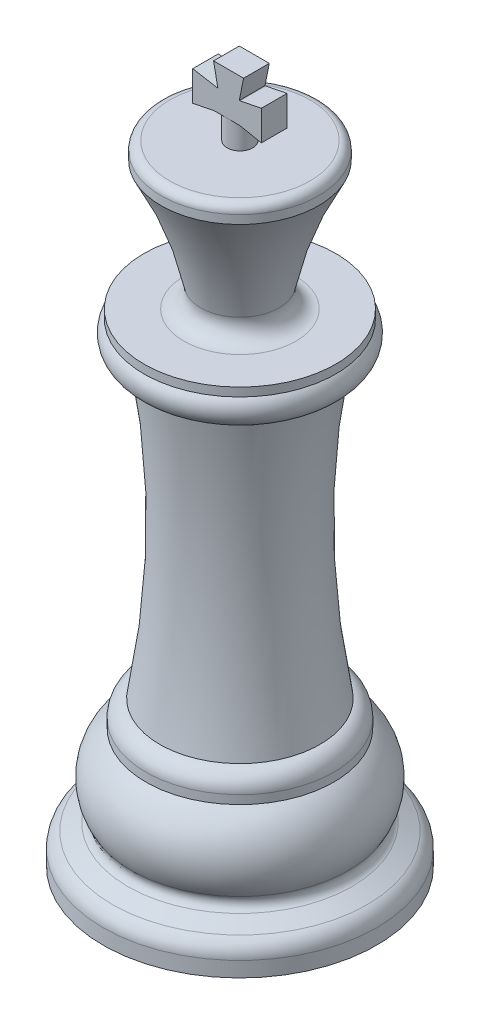
ISO-10303-21;
HEADER;
FILE_DESCRIPTION(('STEP AP214'),'2;1');
FILE_NAME('part.step','',(''),(''),'','','');
FILE_SCHEMA(('AUTOMOTIVE_DESIGN { 1 0 10303 214 1 1 1 1 }'));
ENDSEC;
DATA;
#1=APPLICATION_CONTEXT('core data for automotive mechanical design processes');
#2=APPLICATION_PROTOCOL_DEFINITION('international standard','automotive_design',2000,#1);
#3=PRODUCT_CONTEXT('',#1,'mechanical');
#4=PRODUCT('Part','Part','',(#3));
#5=PRODUCT_RELATED_PRODUCT_CATEGORY('part','',(#4));
#6=PRODUCT_DEFINITION_FORMATION('','',#4);
#7=PRODUCT_DEFINITION_CONTEXT('part definition',#1,'design');
#8=PRODUCT_DEFINITION('design','',#6,#7);
#9=PRODUCT_DEFINITION_SHAPE('','',#8);
#10=(LENGTH_UNIT() NAMED_UNIT(*) SI_UNIT(.MILLI.,.METRE.));
#11=(NAMED_UNIT(*) PLANE_ANGLE_UNIT() SI_UNIT($,.RADIAN.));
#12=(NAMED_UNIT(*) SI_UNIT($,.STERADIAN.) SOLID_ANGLE_UNIT());
#13=UNCERTAINTY_MEASURE_WITH_UNIT(LENGTH_MEASURE(1.E-05),#10,'distance_accuracy_value','');
#14=(GEOMETRIC_REPRESENTATION_CONTEXT(3) GLOBAL_UNCERTAINTY_ASSIGNED_CONTEXT((#13)) GLOBAL_UNIT_ASSIGNED_CONTEXT((#10,
#11,#12)) REPRESENTATION_CONTEXT('',''));
#15=CARTESIAN_POINT('',(0.,0.,0.));
#16=DIRECTION('',(0.,0.,1.));
#17=DIRECTION('',(1.,0.,0.));
#18=AXIS2_PLACEMENT_3D('',#15,#16,#17);
#19=CARTESIAN_POINT('',(0.,48.72,0.));
#20=DIRECTION('',(0.,-1.,0.));
#21=DIRECTION('',(1.,0.,0.));
#22=AXIS2_PLACEMENT_3D('',#19,#20,#21);
#23=PLANE('',#22);
#24=CARTESIAN_POINT('',(-0.682303148717271,48.72,0.));
#25=DIRECTION('',(0.,-1.,0.));
#26=DIRECTION('',(1.,0.,0.));
#27=AXIS2_PLACEMENT_3D('',#24,#25,#26);
#28=CIRCLE('',#27,6.53864170950155);
#29=CARTESIAN_POINT('',(5.85633856078428,48.72,0.));
#30=VERTEX_POINT('',#29);
#31=EDGE_CURVE('E11',#30,#30,#28,.T.);
#32=ORIENTED_EDGE('',*,*,#31,.T.);
#33=EDGE_LOOP('',(#32));
#34=FACE_BOUND('',#33,.T.);
#35=CARTESIAN_POINT('',(-0.682303148717267,48.72,0.));
#36=DIRECTION('',(0.,1.,0.));
#37=DIRECTION('',(-1.,0.,0.));
#38=AXIS2_PLACEMENT_3D('',#35,#36,#37);
#39=CIRCLE('',#38,11.1823031487173);
#40=CARTESIAN_POINT('',(-11.8646062974345,48.72,0.));
#41=VERTEX_POINT('',#40);
#42=EDGE_CURVE('E227',#41,#41,#39,.T.);
#43=ORIENTED_EDGE('',*,*,#42,.T.);
#44=EDGE_LOOP('',(#43));
#45=FACE_BOUND('',#44,.T.);
#46=ADVANCED_FACE('F43',(#34,#45),#23,.F.);
#47=CARTESIAN_POINT('',(-0.68230314871727,42.9698390244359,0.));
#48=DIRECTION('',(0.,1.,0.));
#49=DIRECTION('',(-1.,0.,0.));
#50=AXIS2_PLACEMENT_3D('',#47,#48,#49);
#51=TOROIDAL_SURFACE('',#50,46.4327860754094,42.6399772371375);
#52=CARTESIAN_POINT('',(-0.682303148717271,51.1014057734502,0.));
#53=DIRECTION('',(0.,-1.,0.));
#54=DIRECTION('',(1.,0.,0.));
#55=AXIS2_PLACEMENT_3D('',#52,#53,#54);
#56=CIRCLE('',#55,4.57534610364417);
#57=CARTESIAN_POINT('',(3.8930429549269,51.1014057734502,0.));
#58=VERTEX_POINT('',#57);
#59=EDGE_CURVE('E51',#58,#58,#56,.F.);
#60=ORIENTED_EDGE('',*,*,#59,.T.);
#61=EDGE_LOOP('',(#60));
#62=FACE_BOUND('',#61,.T.);
#63=CARTESIAN_POINT('',(-0.682303148717269,63.72,0.));
#64=DIRECTION('',(0.,1.,0.));
#65=DIRECTION('',(-1.,0.,0.));
#66=AXIS2_PLACEMENT_3D('',#63,#64,#65);
#67=CIRCLE('',#66,9.18230314871727);
#68=CARTESIAN_POINT('',(-9.86460629743453,63.72,0.));
#69=VERTEX_POINT('',#68);
#70=EDGE_CURVE('E326',#69,#69,#67,.T.);
#71=ORIENTED_EDGE('',*,*,#70,.F.);
#72=EDGE_LOOP('',(#71));
#73=FACE_BOUND('',#72,.T.);
#74=ADVANCED_FACE('F288',(#62,#73),#51,.F.);
#75=CARTESIAN_POINT('',(-0.68230314871727,68.72,0.));
#76=DIRECTION('',(0.,1.,0.));
#77=DIRECTION('',(-1.,0.,0.));
#78=AXIS2_PLACEMENT_3D('',#75,#76,#77);
#79=CYLINDRICAL_SURFACE('',#78,9.18230314871726);
#80=CARTESIAN_POINT('',(-0.682303148717269,64.72,0.));
#81=DIRECTION('',(0.,1.,0.));
#82=DIRECTION('',(-1.,0.,0.));
#83=AXIS2_PLACEMENT_3D('',#80,#81,#82);
#84=CIRCLE('',#83,9.18230314871727);
#85=CARTESIAN_POINT('',(-9.86460629743454,64.72,0.));
#86=VERTEX_POINT('',#85);
#87=EDGE_CURVE('E328',#86,#86,#84,.T.);
#88=ORIENTED_EDGE('',*,*,#87,.F.);
#89=EDGE_LOOP('',(#88));
#90=FACE_BOUND('',#89,.T.);
#91=ORIENTED_EDGE('',*,*,#70,.T.);
#92=EDGE_LOOP('',(#91));
#93=FACE_BOUND('',#92,.T.);
#94=ADVANCED_FACE('F284',(#90,#93),#79,.T.);
#95=CARTESIAN_POINT('',(-0.682303148717269,64.72,0.));
#96=DIRECTION('',(0.,1.,0.));
#97=DIRECTION('',(-1.,0.,0.));
#98=AXIS2_PLACEMENT_3D('',#95,#96,#97);
#99=TOROIDAL_SURFACE('',#98,8.18230314871726,1.);
#100=CARTESIAN_POINT('',(-0.682303148717269,65.72,0.));
#101=DIRECTION('',(0.,1.,0.));
#102=DIRECTION('',(-1.,0.,0.));
#103=AXIS2_PLACEMENT_3D('',#100,#101,#102);
#104=CIRCLE('',#103,8.18230314871726);
#105=CARTESIAN_POINT('',(-8.86460629743453,65.72,0.));
#106=VERTEX_POINT('',#105);
#107=EDGE_CURVE('E330',#106,#106,#104,.T.);
#108=ORIENTED_EDGE('',*,*,#107,.F.);
#109=EDGE_LOOP('',(#108));
#110=FACE_BOUND('',#109,.T.);
#111=ORIENTED_EDGE('',*,*,#87,.T.);
#112=EDGE_LOOP('',(#111));
#113=FACE_BOUND('',#112,.T.);
#114=ADVANCED_FACE('F280',(#110,#113),#99,.T.);
#115=CARTESIAN_POINT('',(0.,65.72,0.));
#116=DIRECTION('',(0.,-1.,0.));
#117=DIRECTION('',(1.,0.,0.));
#118=AXIS2_PLACEMENT_3D('',#115,#116,#117);
#119=PLANE('',#118);
#120=CARTESIAN_POINT('',(-0.682303148717269,65.72,0.));
#121=DIRECTION('',(0.,1.,0.));
#122=DIRECTION('',(-1.,0.,0.));
#123=AXIS2_PLACEMENT_3D('',#120,#121,#122);
#124=CIRCLE('',#123,1.5);
#125=CARTESIAN_POINT('',(-2.18230314871727,65.72,0.));
#126=VERTEX_POINT('',#125);
#127=EDGE_CURVE('E251',#126,#126,#124,.T.);
#128=ORIENTED_EDGE('',*,*,#127,.F.);
#129=EDGE_LOOP('',(#128));
#130=FACE_BOUND('',#129,.T.);
#131=ORIENTED_EDGE('',*,*,#107,.T.);
#132=EDGE_LOOP('',(#131));
#133=FACE_BOUND('',#132,.T.);
#134=ADVANCED_FACE('F276',(#130,#133),#119,.F.);
#135=CARTESIAN_POINT('',(-0.68230314871727,68.72,0.));
#136=DIRECTION('',(0.,1.,0.));
#137=DIRECTION('',(-1.,0.,0.));
#138=AXIS2_PLACEMENT_3D('',#135,#136,#137);
#139=CYLINDRICAL_SURFACE('',#138,1.5);
#140=CARTESIAN_POINT('',(-0.68230314871727,68.72,0.));
#141=DIRECTION('',(0.,1.,0.));
#142=DIRECTION('',(-1.,0.,0.));
#143=AXIS2_PLACEMENT_3D('',#140,#141,#142);
#144=CIRCLE('',#143,1.5);
#145=CARTESIAN_POINT('',(-2.18230314871728,68.72,0.));
#146=VERTEX_POINT('',#145);
#147=CARTESIAN_POINT('',(-0.747230212764383,68.72,1.49859416666228));
#148=VERTEX_POINT('',#147);
#149=EDGE_CURVE('E257',#146,#148,#144,.T.);
#150=ORIENTED_EDGE('',*,*,#149,.F.);
#151=CARTESIAN_POINT('',(0.817696851282808,68.72,0.));
#152=VERTEX_POINT('',#151);
#153=EDGE_CURVE('E58',#152,#146,#144,.T.);
#154=ORIENTED_EDGE('',*,*,#153,.F.);
#155=CARTESIAN_POINT('',(-0.617376084670157,68.72,1.49859416666228));
#156=VERTEX_POINT('',#155);
#157=EDGE_CURVE('E250',#156,#152,#144,.T.);
#158=ORIENTED_EDGE('',*,*,#157,.F.);
#159=CARTESIAN_POINT('',(-0.747230212764383,68.72,1.49859416666228));
#160=DIRECTION('',(1.,0.,0.));
#161=VECTOR('',#160,1.);
#162=LINE('',#159,#161);
#163=EDGE_CURVE('E63',#148,#156,#162,.T.);
#164=ORIENTED_EDGE('',*,*,#163,.F.);
#165=EDGE_LOOP('',(#150,#154,#158,#164));
#166=FACE_BOUND('',#165,.T.);
#167=ORIENTED_EDGE('',*,*,#127,.T.);
#168=EDGE_LOOP('',(#167));
#169=FACE_BOUND('',#168,.T.);
#170=ADVANCED_FACE('F265',(#166,#169),#139,.T.);
#171=CARTESIAN_POINT('',(0.,-7.57000000000001,0.));
#172=DIRECTION('',(0.,1.,0.));
#173=DIRECTION('',(-1.,0.,0.));
#174=AXIS2_PLACEMENT_3D('',#171,#172,#173);
#175=PLANE('',#174);
#176=CARTESIAN_POINT('',(-0.68230314871726,-7.57000000000001,0.));
#177=DIRECTION('',(0.,1.,0.));
#178=DIRECTION('',(-1.,0.,0.));
#179=AXIS2_PLACEMENT_3D('',#176,#177,#178);
#180=CIRCLE('',#179,15.9594120981991);
#181=CARTESIAN_POINT('',(-16.6417152469164,-7.57000000000001,0.));
#182=VERTEX_POINT('',#181);
#183=EDGE_CURVE('E245',#182,#182,#180,.T.);
#184=ORIENTED_EDGE('',*,*,#183,.F.);
#185=EDGE_LOOP('',(#184));
#186=FACE_BOUND('',#185,.T.);
#187=ADVANCED_FACE('F275',(#186),#175,.F.);
#188=CARTESIAN_POINT('',(-0.68230314871727,68.72,0.));
#189=DIRECTION('',(0.,1.,0.));
#190=DIRECTION('',(-1.,0.,0.));
#191=AXIS2_PLACEMENT_3D('',#188,#189,#190);
#192=CYLINDRICAL_SURFACE('',#191,15.9594120981991);
#193=CARTESIAN_POINT('',(-0.68230314871726,-5.8015405628289,0.));
#194=DIRECTION('',(0.,-1.,0.));
#195=DIRECTION('',(1.,0.,0.));
#196=AXIS2_PLACEMENT_3D('',#193,#194,#195);
#197=CIRCLE('',#196,15.9594120981991);
#198=CARTESIAN_POINT('',(15.2771089494818,-5.8015405628289,0.));
#199=VERTEX_POINT('',#198);
#200=EDGE_CURVE('E316',#199,#199,#197,.T.);
#201=ORIENTED_EDGE('',*,*,#200,.T.);
#202=EDGE_LOOP('',(#201));
#203=FACE_BOUND('',#202,.T.);
#204=ORIENTED_EDGE('',*,*,#183,.T.);
#205=EDGE_LOOP('',(#204));
#206=FACE_BOUND('',#205,.T.);
#207=ADVANCED_FACE('F352',(#203,#206),#192,.T.);
#208=CARTESIAN_POINT('',(-0.682303148717261,-2.57,0.));
#209=DIRECTION('',(0.,-1.,0.));
#210=DIRECTION('',(1.,0.,0.));
#211=AXIS2_PLACEMENT_3D('',#208,#209,#210);
#212=CONICAL_SURFACE('',#211,11.991992378592,1.10386933277746);
#213=CARTESIAN_POINT('',(-0.682303148717261,-3.10659532978316,0.));
#214=DIRECTION('',(0.,-1.,0.));
#215=DIRECTION('',(1.,0.,0.));
#216=AXIS2_PLACEMENT_3D('',#213,#214,#215);
#217=CIRCLE('',#216,13.0564418250074);
#218=CARTESIAN_POINT('',(12.3741386762901,-3.10659532978316,0.));
#219=VERTEX_POINT('',#218);
#220=EDGE_CURVE('E311',#219,#219,#217,.T.);
#221=ORIENTED_EDGE('',*,*,#220,.T.);
#222=EDGE_LOOP('',(#221));
#223=FACE_BOUND('',#222,.T.);
#224=CARTESIAN_POINT('',(-0.682303148717261,-4.01562896568913,0.));
#225=DIRECTION('',(0.,1.,0.));
#226=DIRECTION('',(-1.,0.,0.));
#227=AXIS2_PLACEMENT_3D('',#224,#225,#226);
#228=CIRCLE('',#227,14.8597008114471);
#229=CARTESIAN_POINT('',(-15.5420039601643,-4.01562896568914,0.));
#230=VERTEX_POINT('',#229);
#231=EDGE_CURVE('E263',#230,#230,#228,.T.);
#232=ORIENTED_EDGE('',*,*,#231,.T.);
#233=EDGE_LOOP('',(#232));
#234=FACE_BOUND('',#233,.T.);
#235=ADVANCED_FACE('F348',(#223,#234),#212,.T.);
#236=CARTESIAN_POINT('',(-0.682303148717262,1.46326241836861,0.));
#237=DIRECTION('',(0.,1.,0.));
#238=DIRECTION('',(-1.,0.,0.));
#239=AXIS2_PLACEMENT_3D('',#236,#237,#238);
#240=TOROIDAL_SURFACE('',#239,7.55146875827196,5.99878785739629);
#241=CARTESIAN_POINT('',(-0.682303148717262,-1.68827685063193,0.));
#242=DIRECTION('',(0.,1.,0.));
#243=DIRECTION('',(-1.,0.,0.));
#244=AXIS2_PLACEMENT_3D('',#241,#242,#243);
#245=CIRCLE('',#244,12.6557077802999);
#246=CARTESIAN_POINT('',(-13.3380109290172,-1.68827685063193,0.));
#247=VERTEX_POINT('',#246);
#248=EDGE_CURVE('E314',#247,#247,#245,.T.);
#249=ORIENTED_EDGE('',*,*,#248,.T.);
#250=EDGE_LOOP('',(#249));
#251=FACE_BOUND('',#250,.T.);
#252=CARTESIAN_POINT('',(-0.682303148717262,6.4,0.));
#253=DIRECTION('',(0.,1.,0.));
#254=DIRECTION('',(-1.,0.,0.));
#255=AXIS2_PLACEMENT_3D('',#252,#253,#254);
#256=CIRCLE('',#255,10.9594120981991);
#257=CARTESIAN_POINT('',(-11.6417152469163,6.39999999999999,0.));
#258=VERTEX_POINT('',#257);
#259=EDGE_CURVE('E242',#258,#258,#256,.T.);
#260=ORIENTED_EDGE('',*,*,#259,.F.);
#261=EDGE_LOOP('',(#260));
#262=FACE_BOUND('',#261,.T.);
#263=ADVANCED_FACE('F351',(#251,#262),#240,.T.);
#264=CARTESIAN_POINT('',(-0.68230314871727,68.72,0.));
#265=DIRECTION('',(0.,1.,0.));
#266=DIRECTION('',(-1.,0.,0.));
#267=AXIS2_PLACEMENT_3D('',#264,#265,#266);
#268=CYLINDRICAL_SURFACE('',#267,10.9594120981991);
#269=CARTESIAN_POINT('',(-0.682303148717262,7.4,0.));
#270=DIRECTION('',(0.,1.,0.));
#271=DIRECTION('',(-1.,0.,0.));
#272=AXIS2_PLACEMENT_3D('',#269,#270,#271);
#273=CIRCLE('',#272,10.9594120981991);
#274=CARTESIAN_POINT('',(-11.6417152469163,7.4,0.));
#275=VERTEX_POINT('',#274);
#276=EDGE_CURVE('E239',#275,#275,#273,.T.);
#277=ORIENTED_EDGE('',*,*,#276,.F.);
#278=EDGE_LOOP('',(#277));
#279=FACE_BOUND('',#278,.T.);
#280=ORIENTED_EDGE('',*,*,#259,.T.);
#281=EDGE_LOOP('',(#280));
#282=FACE_BOUND('',#281,.T.);
#283=ADVANCED_FACE('F357',(#279,#282),#268,.T.);
#284=CARTESIAN_POINT('',(-0.682303148717263,7.43760679300476,0.));
#285=DIRECTION('',(0.,1.,0.));
#286=DIRECTION('',(-1.,0.,0.));
#287=AXIS2_PLACEMENT_3D('',#284,#285,#286);
#288=TOROIDAL_SURFACE('',#287,8.95976569717716,1.99999999999999);
#289=ORIENTED_EDGE('',*,*,#276,.T.);
#290=EDGE_LOOP('',(#289));
#291=FACE_BOUND('',#290,.T.);
#292=CARTESIAN_POINT('',(-0.682303148717262,9.4,0.));
#293=DIRECTION('',(0.,1.,0.));
#294=DIRECTION('',(-1.,0.,0.));
#295=AXIS2_PLACEMENT_3D('',#292,#293,#294);
#296=CIRCLE('',#295,9.34578758922338);
#297=CARTESIAN_POINT('',(-10.0280907379406,9.4,0.));
#298=VERTEX_POINT('',#297);
#299=EDGE_CURVE('E236',#298,#298,#296,.T.);
#300=ORIENTED_EDGE('',*,*,#299,.F.);
#301=EDGE_LOOP('',(#300));
#302=FACE_BOUND('',#301,.T.);
#303=ADVANCED_FACE('F364',(#291,#302),#288,.T.);
#304=CARTESIAN_POINT('',(-0.68230314871727,27.3598851659645,0.));
#305=DIRECTION('',(0.,1.,0.));
#306=DIRECTION('',(-1.,0.,0.));
#307=AXIS2_PLACEMENT_3D('',#304,#305,#306);
#308=TOROIDAL_SURFACE('',#307,107.719780721684,100.);
#309=CARTESIAN_POINT('',(-0.682303148717267,44.4,0.));
#310=DIRECTION('',(0.,1.,0.));
#311=DIRECTION('',(-1.,0.,0.));
#312=AXIS2_PLACEMENT_3D('',#309,#310,#311);
#313=CIRCLE('',#312,9.18230314871726);
#314=CARTESIAN_POINT('',(-9.86460629743453,44.4,0.));
#315=VERTEX_POINT('',#314);
#316=EDGE_CURVE('E233',#315,#315,#313,.T.);
#317=ORIENTED_EDGE('',*,*,#316,.F.);
#318=EDGE_LOOP('',(#317));
#319=FACE_BOUND('',#318,.T.);
#320=ORIENTED_EDGE('',*,*,#299,.T.);
#321=EDGE_LOOP('',(#320));
#322=FACE_BOUND('',#321,.T.);
#323=ADVANCED_FACE('F368',(#319,#322),#308,.F.);
#324=CARTESIAN_POINT('',(-0.682303148717266,46.3151002801742,0.));
#325=DIRECTION('',(0.,1.,0.));
#326=DIRECTION('',(-1.,0.,0.));
#327=AXIS2_PLACEMENT_3D('',#324,#325,#326);
#328=TOROIDAL_SURFACE('',#327,9.75883668362814,2.);
#329=ORIENTED_EDGE('',*,*,#316,.T.);
#330=EDGE_LOOP('',(#329));
#331=FACE_BOUND('',#330,.T.);
#332=CARTESIAN_POINT('',(-0.682303148717267,47.72,0.));
#333=DIRECTION('',(0.,1.,0.));
#334=DIRECTION('',(-1.,0.,0.));
#335=AXIS2_PLACEMENT_3D('',#332,#333,#334);
#336=CIRCLE('',#335,11.1823031487173);
#337=CARTESIAN_POINT('',(-11.8646062974345,47.72,0.));
#338=VERTEX_POINT('',#337);
#339=EDGE_CURVE('E230',#338,#338,#336,.T.);
#340=ORIENTED_EDGE('',*,*,#339,.F.);
#341=EDGE_LOOP('',(#340));
#342=FACE_BOUND('',#341,.T.);
#343=ADVANCED_FACE('F372',(#331,#342),#328,.T.);
#344=CARTESIAN_POINT('',(-0.68230314871727,68.72,0.));
#345=DIRECTION('',(0.,1.,0.));
#346=DIRECTION('',(-1.,0.,0.));
#347=AXIS2_PLACEMENT_3D('',#344,#345,#346);
#348=CYLINDRICAL_SURFACE('',#347,11.1823031487173);
#349=ORIENTED_EDGE('',*,*,#339,.T.);
#350=EDGE_LOOP('',(#349));
#351=FACE_BOUND('',#350,.T.);
#352=ORIENTED_EDGE('',*,*,#42,.F.);
#353=EDGE_LOOP('',(#352));
#354=FACE_BOUND('',#353,.T.);
#355=ADVANCED_FACE('F376',(#351,#354),#348,.T.);
#356=CARTESIAN_POINT('',(0.,68.72,-1.50140583333772));
#357=DIRECTION('',(0.,1.,0.));
#358=DIRECTION('',(0.,0.,1.));
#359=AXIS2_PLACEMENT_3D('',#356,#357,#358);
#360=PLANE('',#359);
#361=DIRECTION('',(-1.,0.,0.));
#362=VECTOR('',#361,1.);
#363=CARTESIAN_POINT('',(0.,68.72,1.49859416666228));
#364=LINE('',#363,#362);
#365=CARTESIAN_POINT('',(0.81769685128273,68.72,1.49859416666228));
#366=VERTEX_POINT('',#365);
#367=EDGE_CURVE('E222',#366,#156,#364,.T.);
#368=ORIENTED_EDGE('',*,*,#367,.T.);
#369=ORIENTED_EDGE('',*,*,#157,.T.);
#370=DIRECTION('',(0.,0.,1.));
#371=VECTOR('',#370,1.);
#372=CARTESIAN_POINT('',(0.81769685128273,68.72,-1.50140583333772));
#373=LINE('',#372,#371);
#374=EDGE_CURVE('E455',#152,#366,#373,.T.);
#375=ORIENTED_EDGE('',*,*,#374,.T.);
#376=EDGE_LOOP('',(#368,#369,#375));
#377=FACE_BOUND('',#376,.T.);
#378=ADVANCED_FACE('F380',(#377),#360,.F.);
#379=CARTESIAN_POINT('',(0.81769685128273,68.72,-1.50140583333772));
#380=VERTEX_POINT('',#379);
#381=EDGE_CURVE('E456',#380,#152,#373,.T.);
#382=ORIENTED_EDGE('',*,*,#381,.T.);
#383=ORIENTED_EDGE('',*,*,#153,.T.);
#384=DIRECTION('',(0.,0.,1.));
#385=VECTOR('',#384,1.);
#386=CARTESIAN_POINT('',(-2.18230314871727,68.72,-1.50140583333772));
#387=LINE('',#386,#385);
#388=CARTESIAN_POINT('',(-2.18230314871727,68.72,-1.50140583333772));
#389=VERTEX_POINT('',#388);
#390=EDGE_CURVE('E452',#389,#146,#387,.T.);
#391=ORIENTED_EDGE('',*,*,#390,.F.);
#392=DIRECTION('',(-1.,0.,0.));
#393=VECTOR('',#392,1.);
#394=CARTESIAN_POINT('',(0.,68.72,-1.50140583333772));
#395=LINE('',#394,#393);
#396=EDGE_CURVE('E189',#380,#389,#395,.T.);
#397=ORIENTED_EDGE('',*,*,#396,.F.);
#398=EDGE_LOOP('',(#382,#383,#391,#397));
#399=FACE_BOUND('',#398,.T.);
#400=ADVANCED_FACE('F385',(#399),#360,.F.);
#401=CARTESIAN_POINT('',(0.,71.22,-1.50140583333772));
#402=DIRECTION('',(0.,-1.,0.));
#403=DIRECTION('',(0.,0.,-1.));
#404=AXIS2_PLACEMENT_3D('',#401,#402,#403);
#405=PLANE('',#404);
#406=DIRECTION('',(1.,0.,0.));
#407=VECTOR('',#406,1.);
#408=CARTESIAN_POINT('',(0.,71.22,1.49859416666228));
#409=LINE('',#408,#407);
#410=CARTESIAN_POINT('',(0.744451389792377,71.22,1.49859416666228));
#411=VERTEX_POINT('',#410);
#412=CARTESIAN_POINT('',(0.81769685128273,71.22,1.49859416666228));
#413=VERTEX_POINT('',#412);
#414=EDGE_CURVE('E196',#411,#413,#409,.T.);
#415=ORIENTED_EDGE('',*,*,#414,.T.);
#416=DIRECTION('',(0.,0.,1.));
#417=VECTOR('',#416,1.);
#418=CARTESIAN_POINT('',(0.81769685128273,71.22,-1.50140583333772));
#419=LINE('',#418,#417);
#420=CARTESIAN_POINT('',(0.81769685128273,71.22,-1.50140583333772));
#421=VERTEX_POINT('',#420);
#422=EDGE_CURVE('E168',#421,#413,#419,.T.);
#423=ORIENTED_EDGE('',*,*,#422,.F.);
#424=DIRECTION('',(1.,0.,0.));
#425=VECTOR('',#424,1.);
#426=CARTESIAN_POINT('',(0.,71.22,-1.50140583333772));
#427=LINE('',#426,#425);
#428=CARTESIAN_POINT('',(0.744451389792377,71.22,-1.50140583333772));
#429=VERTEX_POINT('',#428);
#430=EDGE_CURVE('E149',#429,#421,#427,.T.);
#431=ORIENTED_EDGE('',*,*,#430,.F.);
#432=DIRECTION('',(0.,0.,1.));
#433=VECTOR('',#432,1.);
#434=CARTESIAN_POINT('',(0.744451389792377,71.22,-1.50140583333772));
#435=LINE('',#434,#433);
#436=EDGE_CURVE('E157',#429,#411,#435,.T.);
#437=ORIENTED_EDGE('',*,*,#436,.T.);
#438=EDGE_LOOP('',(#415,#423,#431,#437));
#439=FACE_BOUND('',#438,.T.);
#440=ADVANCED_FACE('F167',(#439),#405,.F.);
#441=CARTESIAN_POINT('',(-13.6647039672583,68.3235198362918,-1.50140583333772));
#442=DIRECTION('',(-0.196116135138184,0.98058067569092,0.));
#443=DIRECTION('',(-0.98058067569092,-0.196116135138184,0.));
#444=AXIS2_PLACEMENT_3D('',#441,#442,#443);
#445=PLANE('',#444);
#446=DIRECTION('',(-0.98058067569092,-0.196116135138184,0.));
#447=VECTOR('',#446,1.);
#448=CARTESIAN_POINT('',(-13.6647039672583,68.3235198362918,1.49859416666228));
#449=LINE('',#448,#447);
#450=CARTESIAN_POINT('',(3.31769685128274,71.72,1.49859416666228));
#451=VERTEX_POINT('',#450);
#452=EDGE_CURVE('E170',#451,#413,#449,.T.);
#453=ORIENTED_EDGE('',*,*,#452,.F.);
#454=DIRECTION('',(0.,0.,1.));
#455=VECTOR('',#454,1.);
#456=CARTESIAN_POINT('',(3.31769685128274,71.72,-1.50140583333772));
#457=LINE('',#456,#455);
#458=CARTESIAN_POINT('',(3.31769685128274,71.72,-1.50140583333772));
#459=VERTEX_POINT('',#458);
#460=EDGE_CURVE('E462',#459,#451,#457,.T.);
#461=ORIENTED_EDGE('',*,*,#460,.F.);
#462=DIRECTION('',(-0.98058067569092,-0.196116135138184,0.));
#463=VECTOR('',#462,1.);
#464=CARTESIAN_POINT('',(-13.6647039672583,68.3235198362918,-1.50140583333772));
#465=LINE('',#464,#463);
#466=EDGE_CURVE('E165',#459,#421,#465,.T.);
#467=ORIENTED_EDGE('',*,*,#466,.T.);
#468=ORIENTED_EDGE('',*,*,#422,.T.);
#469=EDGE_LOOP('',(#453,#461,#467,#468));
#470=FACE_BOUND('',#469,.T.);
#471=ADVANCED_FACE('F384',(#470),#445,.T.);
#472=CARTESIAN_POINT('',(3.31769685128274,0.,-1.50140583333772));
#473=DIRECTION('',(-1.,0.,0.));
#474=DIRECTION('',(0.,-1.,0.));
#475=AXIS2_PLACEMENT_3D('',#472,#473,#474);
#476=PLANE('',#475);
#477=DIRECTION('',(0.,-1.,0.));
#478=VECTOR('',#477,1.);
#479=CARTESIAN_POINT('',(3.31769685128274,0.,1.49859416666228));
#480=LINE('',#479,#478);
#481=CARTESIAN_POINT('',(3.31769685128274,68.22,1.49859416666228));
#482=VERTEX_POINT('',#481);
#483=EDGE_CURVE('E173',#451,#482,#480,.T.);
#484=ORIENTED_EDGE('',*,*,#483,.T.);
#485=DIRECTION('',(0.,0.,1.));
#486=VECTOR('',#485,1.);
#487=CARTESIAN_POINT('',(3.31769685128274,68.22,-1.50140583333772));
#488=LINE('',#487,#486);
#489=CARTESIAN_POINT('',(3.31769685128274,68.22,-1.50140583333772));
#490=VERTEX_POINT('',#489);
#491=EDGE_CURVE('E459',#490,#482,#488,.T.);
#492=ORIENTED_EDGE('',*,*,#491,.F.);
#493=DIRECTION('',(0.,-1.,0.));
#494=VECTOR('',#493,1.);
#495=CARTESIAN_POINT('',(3.31769685128274,0.,-1.50140583333772));
#496=LINE('',#495,#494);
#497=EDGE_CURVE('E193',#459,#490,#496,.T.);
#498=ORIENTED_EDGE('',*,*,#497,.F.);
#499=ORIENTED_EDGE('',*,*,#460,.T.);
#500=EDGE_LOOP('',(#484,#492,#498,#499));
#501=FACE_BOUND('',#500,.T.);
#502=ADVANCED_FACE('F419',(#501),#476,.F.);
#503=CARTESIAN_POINT('',(13.2468344942801,66.2341724714005,-1.50140583333772));
#504=DIRECTION('',(0.196116135138184,0.98058067569092,0.));
#505=DIRECTION('',(-0.98058067569092,0.196116135138184,0.));
#506=AXIS2_PLACEMENT_3D('',#503,#504,#505);
#507=PLANE('',#506);
#508=DIRECTION('',(-0.98058067569092,0.196116135138184,0.));
#509=VECTOR('',#508,1.);
#510=CARTESIAN_POINT('',(13.2468344942801,66.2341724714005,1.49859416666228));
#511=LINE('',#510,#509);
#512=EDGE_CURVE('E218',#482,#366,#511,.T.);
#513=ORIENTED_EDGE('',*,*,#512,.T.);
#514=ORIENTED_EDGE('',*,*,#374,.F.);
#515=ORIENTED_EDGE('',*,*,#381,.F.);
#516=DIRECTION('',(-0.98058067569092,0.196116135138184,0.));
#517=VECTOR('',#516,1.);
#518=CARTESIAN_POINT('',(13.2468344942801,66.2341724714005,-1.50140583333772));
#519=LINE('',#518,#517);
#520=EDGE_CURVE('E191',#490,#380,#519,.T.);
#521=ORIENTED_EDGE('',*,*,#520,.F.);
#522=ORIENTED_EDGE('',*,*,#491,.T.);
#523=EDGE_LOOP('',(#513,#514,#515,#521,#522));
#524=FACE_BOUND('',#523,.T.);
#525=ADVANCED_FACE('F415',(#524),#507,.F.);
#526=CARTESIAN_POINT('',(-2.18230314871727,68.72,1.49859416666228));
#527=VERTEX_POINT('',#526);
#528=EDGE_CURVE('E451',#146,#527,#387,.T.);
#529=ORIENTED_EDGE('',*,*,#528,.F.);
#530=ORIENTED_EDGE('',*,*,#149,.T.);
#531=EDGE_CURVE('E215',#148,#527,#364,.T.);
#532=ORIENTED_EDGE('',*,*,#531,.T.);
#533=EDGE_LOOP('',(#529,#530,#532));
#534=FACE_BOUND('',#533,.T.);
#535=ADVANCED_FACE('F411',(#534),#360,.F.);
#536=CARTESIAN_POINT('',(-13.2993193518738,66.4965967593687,-1.50140583333772));
#537=DIRECTION('',(-0.196116135138185,0.98058067569092,0.));
#538=DIRECTION('',(-0.98058067569092,-0.196116135138185,0.));
#539=AXIS2_PLACEMENT_3D('',#536,#537,#538);
#540=PLANE('',#539);
#541=DIRECTION('',(-0.98058067569092,-0.196116135138185,0.));
#542=VECTOR('',#541,1.);
#543=CARTESIAN_POINT('',(-13.2993193518738,66.4965967593687,1.49859416666228));
#544=LINE('',#543,#542);
#545=CARTESIAN_POINT('',(-4.68230314871726,68.22,1.49859416666228));
#546=VERTEX_POINT('',#545);
#547=EDGE_CURVE('E213',#527,#546,#544,.T.);
#548=ORIENTED_EDGE('',*,*,#547,.T.);
#549=DIRECTION('',(0.,0.,1.));
#550=VECTOR('',#549,1.);
#551=CARTESIAN_POINT('',(-4.68230314871726,68.22,-1.50140583333772));
#552=LINE('',#551,#550);
#553=CARTESIAN_POINT('',(-4.68230314871726,68.22,-1.50140583333772));
#554=VERTEX_POINT('',#553);
#555=EDGE_CURVE('E448',#554,#546,#552,.T.);
#556=ORIENTED_EDGE('',*,*,#555,.F.);
#557=DIRECTION('',(-0.98058067569092,-0.196116135138185,0.));
#558=VECTOR('',#557,1.);
#559=CARTESIAN_POINT('',(-13.2993193518738,66.4965967593687,-1.50140583333772));
#560=LINE('',#559,#558);
#561=EDGE_CURVE('E187',#389,#554,#560,.T.);
#562=ORIENTED_EDGE('',*,*,#561,.F.);
#563=ORIENTED_EDGE('',*,*,#390,.T.);
#564=ORIENTED_EDGE('',*,*,#528,.T.);
#565=EDGE_LOOP('',(#548,#556,#562,#563,#564));
#566=FACE_BOUND('',#565,.T.);
#567=ADVANCED_FACE('F407',(#566),#540,.F.);
#568=CARTESIAN_POINT('',(-4.68230314871726,0.,-1.50140583333772));
#569=DIRECTION('',(1.,0.,0.));
#570=DIRECTION('',(0.,0.,-1.));
#571=AXIS2_PLACEMENT_3D('',#568,#569,#570);
#572=PLANE('',#571);
#573=DIRECTION('',(0.,1.,0.));
#574=VECTOR('',#573,1.);
#575=CARTESIAN_POINT('',(-4.68230314871726,0.,1.49859416666228));
#576=LINE('',#575,#574);
#577=CARTESIAN_POINT('',(-4.68230314871726,71.72,1.49859416666228));
#578=VERTEX_POINT('',#577);
#579=EDGE_CURVE('E211',#546,#578,#576,.T.);
#580=ORIENTED_EDGE('',*,*,#579,.T.);
#581=DIRECTION('',(0.,0.,1.));
#582=VECTOR('',#581,1.);
#583=CARTESIAN_POINT('',(-4.68230314871726,71.72,-1.50140583333772));
#584=LINE('',#583,#582);
#585=CARTESIAN_POINT('',(-4.68230314871726,71.72,-1.50140583333772));
#586=VERTEX_POINT('',#585);
#587=EDGE_CURVE('E445',#586,#578,#584,.T.);
#588=ORIENTED_EDGE('',*,*,#587,.F.);
#589=DIRECTION('',(0.,1.,0.));
#590=VECTOR('',#589,1.);
#591=CARTESIAN_POINT('',(-4.68230314871726,0.,-1.50140583333772));
#592=LINE('',#591,#590);
#593=EDGE_CURVE('E185',#554,#586,#592,.T.);
#594=ORIENTED_EDGE('',*,*,#593,.F.);
#595=ORIENTED_EDGE('',*,*,#555,.T.);
#596=EDGE_LOOP('',(#580,#588,#594,#595));
#597=FACE_BOUND('',#596,.T.);
#598=ADVANCED_FACE('F403',(#597),#572,.F.);
#599=CARTESIAN_POINT('',(12.0531534508441,68.7875655573798,-1.50140583333772));
#600=DIRECTION('',(-0.172593313195412,-0.98499317167188,0.));
#601=DIRECTION('',(0.98499317167188,-0.172593313195412,0.));
#602=AXIS2_PLACEMENT_3D('',#599,#600,#601);
#603=PLANE('',#602);
#604=DIRECTION('',(0.98499317167188,-0.172593313195412,0.));
#605=VECTOR('',#604,1.);
#606=CARTESIAN_POINT('',(12.0531534508441,68.7875655573798,1.49859416666228));
#607=LINE('',#606,#605);
#608=CARTESIAN_POINT('',(-1.82879407169797,71.22,1.49859416666228));
#609=VERTEX_POINT('',#608);
#610=EDGE_CURVE('E208',#578,#609,#607,.T.);
#611=ORIENTED_EDGE('',*,*,#610,.T.);
#612=DIRECTION('',(0.,0.,1.));
#613=VECTOR('',#612,1.);
#614=CARTESIAN_POINT('',(-1.82879407169797,71.22,-1.50140583333772));
#615=LINE('',#614,#613);
#616=CARTESIAN_POINT('',(-1.82879407169797,71.22,-1.50140583333772));
#617=VERTEX_POINT('',#616);
#618=EDGE_CURVE('E443',#617,#609,#615,.T.);
#619=ORIENTED_EDGE('',*,*,#618,.F.);
#620=DIRECTION('',(0.98499317167188,-0.172593313195412,0.));
#621=VECTOR('',#620,1.);
#622=CARTESIAN_POINT('',(12.0531534508441,68.7875655573798,-1.50140583333772));
#623=LINE('',#622,#621);
#624=EDGE_CURVE('E183',#586,#617,#623,.T.);
#625=ORIENTED_EDGE('',*,*,#624,.F.);
#626=ORIENTED_EDGE('',*,*,#587,.T.);
#627=EDGE_LOOP('',(#611,#619,#625,#626));
#628=FACE_BOUND('',#627,.T.);
#629=ADVANCED_FACE('F399',(#628),#603,.F.);
#630=CARTESIAN_POINT('',(0.,71.22,-1.50140583333772));
#631=DIRECTION('',(0.,1.,0.));
#632=DIRECTION('',(0.,0.,1.));
#633=AXIS2_PLACEMENT_3D('',#630,#631,#632);
#634=PLANE('',#633);
#635=DIRECTION('',(-1.,0.,0.));
#636=VECTOR('',#635,1.);
#637=CARTESIAN_POINT('',(0.,71.22,1.49859416666228));
#638=LINE('',#637,#636);
#639=CARTESIAN_POINT('',(-1.75554861020762,71.22,1.49859416666228));
#640=VERTEX_POINT('',#639);
#641=EDGE_CURVE('E205',#640,#609,#638,.T.);
#642=ORIENTED_EDGE('',*,*,#641,.F.);
#643=DIRECTION('',(0.,0.,1.));
#644=VECTOR('',#643,1.);
#645=CARTESIAN_POINT('',(-1.75554861020762,71.22,-1.50140583333772));
#646=LINE('',#645,#644);
#647=CARTESIAN_POINT('',(-1.75554861020762,71.22,-1.50140583333772));
#648=VERTEX_POINT('',#647);
#649=EDGE_CURVE('E441',#648,#640,#646,.T.);
#650=ORIENTED_EDGE('',*,*,#649,.F.);
#651=DIRECTION('',(-1.,0.,0.));
#652=VECTOR('',#651,1.);
#653=CARTESIAN_POINT('',(0.,71.22,-1.50140583333772));
#654=LINE('',#653,#652);
#655=EDGE_CURVE('E180',#648,#617,#654,.T.);
#656=ORIENTED_EDGE('',*,*,#655,.T.);
#657=ORIENTED_EDGE('',*,*,#618,.T.);
#658=EDGE_LOOP('',(#642,#650,#656,#657));
#659=FACE_BOUND('',#658,.T.);
#660=ADVANCED_FACE('F395',(#659),#634,.T.);
#661=CARTESIAN_POINT('',(12.0081263363388,2.40162526726776,-1.50140583333772));
#662=DIRECTION('',(-0.98058067569092,-0.196116135138184,0.));
#663=DIRECTION('',(0.196116135138184,-0.98058067569092,0.));
#664=AXIS2_PLACEMENT_3D('',#661,#662,#663);
#665=PLANE('',#664);
#666=DIRECTION('',(0.196116135138184,-0.98058067569092,0.));
#667=VECTOR('',#666,1.);
#668=CARTESIAN_POINT('',(12.0081263363388,2.40162526726776,1.49859416666228));
#669=LINE('',#668,#667);
#670=CARTESIAN_POINT('',(-2.25554861020762,73.72,1.49859416666228));
#671=VERTEX_POINT('',#670);
#672=EDGE_CURVE('E202',#671,#640,#669,.T.);
#673=ORIENTED_EDGE('',*,*,#672,.F.);
#674=DIRECTION('',(0.,0.,1.));
#675=VECTOR('',#674,1.);
#676=CARTESIAN_POINT('',(-2.25554861020762,73.72,-1.50140583333772));
#677=LINE('',#676,#675);
#678=CARTESIAN_POINT('',(-2.25554861020762,73.72,-1.50140583333772));
#679=VERTEX_POINT('',#678);
#680=EDGE_CURVE('E439',#679,#671,#677,.T.);
#681=ORIENTED_EDGE('',*,*,#680,.F.);
#682=DIRECTION('',(0.196116135138184,-0.98058067569092,0.));
#683=VECTOR('',#682,1.);
#684=CARTESIAN_POINT('',(12.0081263363388,2.40162526726776,-1.50140583333772));
#685=LINE('',#684,#683);
#686=EDGE_CURVE('E177',#679,#648,#685,.T.);
#687=ORIENTED_EDGE('',*,*,#686,.T.);
#688=ORIENTED_EDGE('',*,*,#649,.T.);
#689=EDGE_LOOP('',(#673,#681,#687,#688));
#690=FACE_BOUND('',#689,.T.);
#691=ADVANCED_FACE('F391',(#690),#665,.T.);
#692=CARTESIAN_POINT('',(0.,73.72,-1.50140583333772));
#693=DIRECTION('',(0.,1.,0.));
#694=DIRECTION('',(0.,0.,1.));
#695=AXIS2_PLACEMENT_3D('',#692,#693,#694);
#696=PLANE('',#695);
#697=DIRECTION('',(-1.,0.,0.));
#698=VECTOR('',#697,1.);
#699=CARTESIAN_POINT('',(0.,73.72,1.49859416666228));
#700=LINE('',#699,#698);
#701=CARTESIAN_POINT('',(1.24445138979238,73.72,1.49859416666228));
#702=VERTEX_POINT('',#701);
#703=EDGE_CURVE('E199',#702,#671,#700,.T.);
#704=ORIENTED_EDGE('',*,*,#703,.F.);
#705=DIRECTION('',(0.,0.,1.));
#706=VECTOR('',#705,1.);
#707=CARTESIAN_POINT('',(1.24445138979238,73.72,-1.50140583333772));
#708=LINE('',#707,#706);
#709=CARTESIAN_POINT('',(1.24445138979238,73.72,-1.50140583333772));
#710=VERTEX_POINT('',#709);
#711=EDGE_CURVE('E164',#710,#702,#708,.T.);
#712=ORIENTED_EDGE('',*,*,#711,.F.);
#713=DIRECTION('',(-1.,0.,0.));
#714=VECTOR('',#713,1.);
#715=CARTESIAN_POINT('',(0.,73.72,-1.50140583333772));
#716=LINE('',#715,#714);
#717=EDGE_CURVE('E153',#710,#679,#716,.T.);
#718=ORIENTED_EDGE('',*,*,#717,.T.);
#719=ORIENTED_EDGE('',*,*,#680,.T.);
#720=EDGE_LOOP('',(#704,#712,#718,#719));
#721=FACE_BOUND('',#720,.T.);
#722=ADVANCED_FACE('F388',(#721),#696,.T.);
#723=CARTESIAN_POINT('',(-12.9803352021227,2.59606704042454,-1.50140583333772));
#724=DIRECTION('',(-0.98058067569092,0.196116135138184,0.));
#725=DIRECTION('',(-0.196116135138184,-0.98058067569092,0.));
#726=AXIS2_PLACEMENT_3D('',#723,#724,#725);
#727=PLANE('',#726);
#728=DIRECTION('',(-0.196116135138184,-0.98058067569092,0.));
#729=VECTOR('',#728,1.);
#730=CARTESIAN_POINT('',(-12.9803352021227,2.59606704042454,1.49859416666228));
#731=LINE('',#730,#729);
#732=EDGE_CURVE('E160',#702,#411,#731,.T.);
#733=ORIENTED_EDGE('',*,*,#732,.T.);
#734=ORIENTED_EDGE('',*,*,#436,.F.);
#735=DIRECTION('',(-0.196116135138184,-0.98058067569092,0.));
#736=VECTOR('',#735,1.);
#737=CARTESIAN_POINT('',(-12.9803352021227,2.59606704042454,-1.50140583333772));
#738=LINE('',#737,#736);
#739=EDGE_CURVE('E144',#710,#429,#738,.T.);
#740=ORIENTED_EDGE('',*,*,#739,.F.);
#741=ORIENTED_EDGE('',*,*,#711,.T.);
#742=EDGE_LOOP('',(#733,#734,#740,#741));
#743=FACE_BOUND('',#742,.T.);
#744=ADVANCED_FACE('F158',(#743),#727,.F.);
#745=CARTESIAN_POINT('',(0.,0.,-1.50140583333772));
#746=DIRECTION('',(0.,0.,1.));
#747=DIRECTION('',(1.,0.,0.));
#748=AXIS2_PLACEMENT_3D('',#745,#746,#747);
#749=PLANE('',#748);
#750=ORIENTED_EDGE('',*,*,#430,.T.);
#751=ORIENTED_EDGE('',*,*,#466,.F.);
#752=ORIENTED_EDGE('',*,*,#497,.T.);
#753=ORIENTED_EDGE('',*,*,#520,.T.);
#754=ORIENTED_EDGE('',*,*,#396,.T.);
#755=ORIENTED_EDGE('',*,*,#561,.T.);
#756=ORIENTED_EDGE('',*,*,#593,.T.);
#757=ORIENTED_EDGE('',*,*,#624,.T.);
#758=ORIENTED_EDGE('',*,*,#655,.F.);
#759=ORIENTED_EDGE('',*,*,#686,.F.);
#760=ORIENTED_EDGE('',*,*,#717,.F.);
#761=ORIENTED_EDGE('',*,*,#739,.T.);
#762=EDGE_LOOP('',(#750,#751,#752,#753,#754,#755,#756,#757,#758,#759,#760,#761));
#763=FACE_BOUND('',#762,.T.);
#764=ADVANCED_FACE('F146',(#763),#749,.F.);
#765=CARTESIAN_POINT('',(0.,0.,1.49859416666228));
#766=DIRECTION('',(0.,0.,1.));
#767=DIRECTION('',(1.,0.,0.));
#768=AXIS2_PLACEMENT_3D('',#765,#766,#767);
#769=PLANE('',#768);
#770=ORIENTED_EDGE('',*,*,#414,.F.);
#771=ORIENTED_EDGE('',*,*,#732,.F.);
#772=ORIENTED_EDGE('',*,*,#703,.T.);
#773=ORIENTED_EDGE('',*,*,#672,.T.);
#774=ORIENTED_EDGE('',*,*,#641,.T.);
#775=ORIENTED_EDGE('',*,*,#610,.F.);
#776=ORIENTED_EDGE('',*,*,#579,.F.);
#777=ORIENTED_EDGE('',*,*,#547,.F.);
#778=ORIENTED_EDGE('',*,*,#531,.F.);
#779=ORIENTED_EDGE('',*,*,#163,.T.);
#780=ORIENTED_EDGE('',*,*,#367,.F.);
#781=ORIENTED_EDGE('',*,*,#512,.F.);
#782=ORIENTED_EDGE('',*,*,#483,.F.);
#783=ORIENTED_EDGE('',*,*,#452,.T.);
#784=EDGE_LOOP('',(#770,#771,#772,#773,#774,#775,#776,#777,#778,#779,#780,#781,#782,#783));
#785=FACE_BOUND('',#784,.T.);
#786=ADVANCED_FACE('F299',(#785),#769,.T.);
#787=CARTESIAN_POINT('',(-0.68230314871726,-5.8015405628289,0.));
#788=DIRECTION('',(0.,-1.,0.));
#789=DIRECTION('',(1.,0.,0.));
#790=AXIS2_PLACEMENT_3D('',#787,#788,#789);
#791=TOROIDAL_SURFACE('',#790,13.9594120981991,2.);
#792=ORIENTED_EDGE('',*,*,#200,.F.);
#793=EDGE_LOOP('',(#792));
#794=FACE_BOUND('',#793,.T.);
#795=ORIENTED_EDGE('',*,*,#231,.F.);
#796=EDGE_LOOP('',(#795));
#797=FACE_BOUND('',#796,.T.);
#798=ADVANCED_FACE('F296',(#794,#797),#791,.T.);
#799=CARTESIAN_POINT('',(-0.682303148717261,-2.21363953121327,0.));
#800=DIRECTION('',(0.,1.,0.));
#801=DIRECTION('',(-1.,0.,0.));
#802=AXIS2_PLACEMENT_3D('',#799,#800,#801);
#803=TOROIDAL_SURFACE('',#802,13.5065861816314,1.);
#804=ORIENTED_EDGE('',*,*,#220,.F.);
#805=EDGE_LOOP('',(#804));
#806=FACE_BOUND('',#805,.T.);
#807=ORIENTED_EDGE('',*,*,#248,.F.);
#808=EDGE_LOOP('',(#807));
#809=FACE_BOUND('',#808,.T.);
#810=ADVANCED_FACE('F298',(#806,#809),#803,.F.);
#811=CARTESIAN_POINT('',(-0.682303148717271,50.72,0.));
#812=DIRECTION('',(0.,1.,0.));
#813=DIRECTION('',(-1.,0.,0.));
#814=AXIS2_PLACEMENT_3D('',#811,#812,#813);
#815=TOROIDAL_SURFACE('',#814,6.53864170950155,2.);
#816=ORIENTED_EDGE('',*,*,#31,.F.);
#817=EDGE_LOOP('',(#816));
#818=FACE_BOUND('',#817,.T.);
#819=ORIENTED_EDGE('',*,*,#59,.F.);
#820=EDGE_LOOP('',(#819));
#821=FACE_BOUND('',#820,.T.);
#822=ADVANCED_FACE('F45',(#818,#821),#815,.F.);
#823=CLOSED_SHELL('',(#46,#74,#94,#114,#134,#170,#187,#207,#235,#263,#283,#303,#323,#343,#355,
#378,#400,#440,#471,#502,#525,#535,#567,#598,#629,#660,#691,#722,#744,#764,#786,#798,#810,#822));
#824=MANIFOLD_SOLID_BREP('B2',#823);
#825=ADVANCED_BREP_SHAPE_REPRESENTATION('',(#18,#824),#14);
#826=SHAPE_DEFINITION_REPRESENTATION(#9,#825);
ENDSEC;
END-ISO-10303-21;
